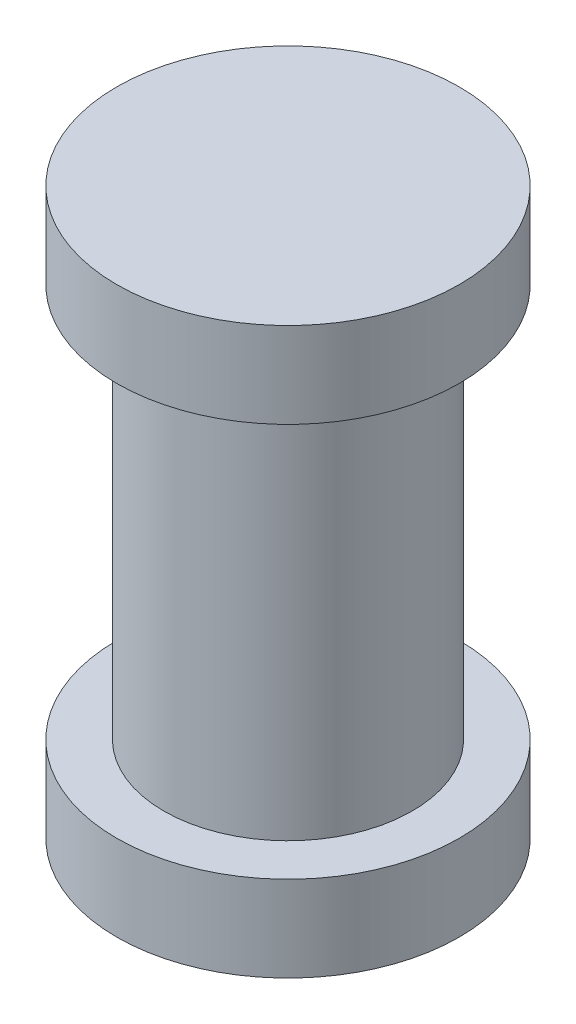
ISO-10303-21;
HEADER;
FILE_DESCRIPTION(('STEP AP214'),'2;1');
FILE_NAME('part.step','',(''),(''),'','','');
FILE_SCHEMA(('AUTOMOTIVE_DESIGN { 1 0 10303 214 1 1 1 1 }'));
ENDSEC;
DATA;
#1=APPLICATION_CONTEXT('core data for automotive mechanical design processes');
#2=APPLICATION_PROTOCOL_DEFINITION('international standard','automotive_design',2000,#1);
#3=PRODUCT_CONTEXT('',#1,'mechanical');
#4=PRODUCT('Part','Part','',(#3));
#5=PRODUCT_RELATED_PRODUCT_CATEGORY('part','',(#4));
#6=PRODUCT_DEFINITION_FORMATION('','',#4);
#7=PRODUCT_DEFINITION_CONTEXT('part definition',#1,'design');
#8=PRODUCT_DEFINITION('design','',#6,#7);
#9=PRODUCT_DEFINITION_SHAPE('','',#8);
#10=(LENGTH_UNIT() NAMED_UNIT(*) SI_UNIT(.MILLI.,.METRE.));
#11=(NAMED_UNIT(*) PLANE_ANGLE_UNIT() SI_UNIT($,.RADIAN.));
#12=(NAMED_UNIT(*) SI_UNIT($,.STERADIAN.) SOLID_ANGLE_UNIT());
#13=UNCERTAINTY_MEASURE_WITH_UNIT(LENGTH_MEASURE(1.E-05),#10,'distance_accuracy_value','');
#14=(GEOMETRIC_REPRESENTATION_CONTEXT(3) GLOBAL_UNCERTAINTY_ASSIGNED_CONTEXT((#13)) GLOBAL_UNIT_ASSIGNED_CONTEXT((#10,
#11,#12)) REPRESENTATION_CONTEXT('',''));
#15=CARTESIAN_POINT('',(0.,0.,0.));
#16=DIRECTION('',(0.,0.,1.));
#17=DIRECTION('',(1.,0.,0.));
#18=AXIS2_PLACEMENT_3D('',#15,#16,#17);
#19=CARTESIAN_POINT('',(0.,2.3,0.));
#20=DIRECTION('',(0.,-1.,0.));
#21=DIRECTION('',(0.,0.,-1.));
#22=AXIS2_PLACEMENT_3D('',#19,#20,#21);
#23=CYLINDRICAL_SURFACE('',#22,1.45);
#24=CARTESIAN_POINT('',(0.,2.3,0.));
#25=DIRECTION('',(0.,1.,0.));
#26=DIRECTION('',(0.,0.,1.));
#27=AXIS2_PLACEMENT_3D('',#24,#25,#26);
#28=CIRCLE('',#27,1.45);
#29=CARTESIAN_POINT('',(0.,2.3,1.45));
#30=VERTEX_POINT('',#29);
#31=EDGE_CURVE('E10',#30,#30,#28,.T.);
#32=ORIENTED_EDGE('',*,*,#31,.F.);
#33=EDGE_LOOP('',(#32));
#34=FACE_BOUND('',#33,.T.);
#35=CARTESIAN_POINT('',(0.,-2.3,0.));
#36=DIRECTION('',(0.,1.,0.));
#37=DIRECTION('',(0.,0.,1.));
#38=AXIS2_PLACEMENT_3D('',#35,#36,#37);
#39=CIRCLE('',#38,1.45);
#40=CARTESIAN_POINT('',(0.,-2.3,1.45));
#41=VERTEX_POINT('',#40);
#42=EDGE_CURVE('E35',#41,#41,#39,.T.);
#43=ORIENTED_EDGE('',*,*,#42,.T.);
#44=EDGE_LOOP('',(#43));
#45=FACE_BOUND('',#44,.T.);
#46=ADVANCED_FACE('F32',(#34,#45),#23,.T.);
#47=CARTESIAN_POINT('',(0.,3.3,0.));
#48=DIRECTION('',(0.,-1.,0.));
#49=DIRECTION('',(0.,0.,-1.));
#50=AXIS2_PLACEMENT_3D('',#47,#48,#49);
#51=CYLINDRICAL_SURFACE('',#50,2.);
#52=CARTESIAN_POINT('',(0.,3.3,0.));
#53=DIRECTION('',(0.,1.,0.));
#54=DIRECTION('',(0.,0.,1.));
#55=AXIS2_PLACEMENT_3D('',#52,#53,#54);
#56=CIRCLE('',#55,2.);
#57=CARTESIAN_POINT('',(0.,3.3,2.));
#58=VERTEX_POINT('',#57);
#59=EDGE_CURVE('E39',#58,#58,#56,.T.);
#60=ORIENTED_EDGE('',*,*,#59,.F.);
#61=EDGE_LOOP('',(#60));
#62=FACE_BOUND('',#61,.T.);
#63=CARTESIAN_POINT('',(0.,2.3,0.));
#64=DIRECTION('',(0.,1.,0.));
#65=DIRECTION('',(0.,0.,1.));
#66=AXIS2_PLACEMENT_3D('',#63,#64,#65);
#67=CIRCLE('',#66,2.);
#68=CARTESIAN_POINT('',(0.,2.3,2.));
#69=VERTEX_POINT('',#68);
#70=EDGE_CURVE('E43',#69,#69,#67,.T.);
#71=ORIENTED_EDGE('',*,*,#70,.T.);
#72=EDGE_LOOP('',(#71));
#73=FACE_BOUND('',#72,.T.);
#74=ADVANCED_FACE('F80',(#62,#73),#51,.T.);
#75=CARTESIAN_POINT('',(0.,3.3,0.));
#76=DIRECTION('',(0.,1.,0.));
#77=DIRECTION('',(0.,0.,1.));
#78=AXIS2_PLACEMENT_3D('',#75,#76,#77);
#79=PLANE('',#78);
#80=ORIENTED_EDGE('',*,*,#59,.T.);
#81=EDGE_LOOP('',(#80));
#82=FACE_BOUND('',#81,.T.);
#83=ADVANCED_FACE('F76',(#82),#79,.T.);
#84=CARTESIAN_POINT('',(0.,2.3,0.));
#85=DIRECTION('',(0.,1.,0.));
#86=DIRECTION('',(0.,0.,1.));
#87=AXIS2_PLACEMENT_3D('',#84,#85,#86);
#88=PLANE('',#87);
#89=ORIENTED_EDGE('',*,*,#31,.T.);
#90=EDGE_LOOP('',(#89));
#91=FACE_BOUND('',#90,.T.);
#92=ORIENTED_EDGE('',*,*,#70,.F.);
#93=EDGE_LOOP('',(#92));
#94=FACE_BOUND('',#93,.T.);
#95=ADVANCED_FACE('F68',(#91,#94),#88,.F.);
#96=CARTESIAN_POINT('',(0.,-3.3,0.));
#97=DIRECTION('',(0.,1.,0.));
#98=DIRECTION('',(0.,0.,1.));
#99=AXIS2_PLACEMENT_3D('',#96,#97,#98);
#100=CYLINDRICAL_SURFACE('',#99,2.);
#101=CARTESIAN_POINT('',(0.,-3.3,0.));
#102=DIRECTION('',(0.,1.,0.));
#103=DIRECTION('',(0.,0.,1.));
#104=AXIS2_PLACEMENT_3D('',#101,#102,#103);
#105=CIRCLE('',#104,2.);
#106=CARTESIAN_POINT('',(0.,-3.3,2.));
#107=VERTEX_POINT('',#106);
#108=EDGE_CURVE('E51',#107,#107,#105,.T.);
#109=ORIENTED_EDGE('',*,*,#108,.T.);
#110=EDGE_LOOP('',(#109));
#111=FACE_BOUND('',#110,.T.);
#112=CARTESIAN_POINT('',(0.,-2.3,0.));
#113=DIRECTION('',(0.,1.,0.));
#114=DIRECTION('',(0.,0.,1.));
#115=AXIS2_PLACEMENT_3D('',#112,#113,#114);
#116=CIRCLE('',#115,2.);
#117=CARTESIAN_POINT('',(0.,-2.3,2.));
#118=VERTEX_POINT('',#117);
#119=EDGE_CURVE('E48',#118,#118,#116,.T.);
#120=ORIENTED_EDGE('',*,*,#119,.F.);
#121=EDGE_LOOP('',(#120));
#122=FACE_BOUND('',#121,.T.);
#123=ADVANCED_FACE('F66',(#111,#122),#100,.T.);
#124=CARTESIAN_POINT('',(0.,-3.3,0.));
#125=DIRECTION('',(0.,-1.,0.));
#126=DIRECTION('',(0.,0.,1.));
#127=AXIS2_PLACEMENT_3D('',#124,#125,#126);
#128=PLANE('',#127);
#129=ORIENTED_EDGE('',*,*,#108,.F.);
#130=EDGE_LOOP('',(#129));
#131=FACE_BOUND('',#130,.T.);
#132=ADVANCED_FACE('F62',(#131),#128,.T.);
#133=CARTESIAN_POINT('',(0.,-2.3,0.));
#134=DIRECTION('',(0.,-1.,0.));
#135=DIRECTION('',(0.,0.,1.));
#136=AXIS2_PLACEMENT_3D('',#133,#134,#135);
#137=PLANE('',#136);
#138=ORIENTED_EDGE('',*,*,#42,.F.);
#139=EDGE_LOOP('',(#138));
#140=FACE_BOUND('',#139,.T.);
#141=ORIENTED_EDGE('',*,*,#119,.T.);
#142=EDGE_LOOP('',(#141));
#143=FACE_BOUND('',#142,.T.);
#144=ADVANCED_FACE('F59',(#140,#143),#137,.F.);
#145=CLOSED_SHELL('',(#46,#74,#83,#95,#123,#132,#144));
#146=MANIFOLD_SOLID_BREP('B2',#145);
#147=ADVANCED_BREP_SHAPE_REPRESENTATION('',(#18,#146),#14);
#148=SHAPE_DEFINITION_REPRESENTATION(#9,#147);
ENDSEC;
END-ISO-10303-21;
